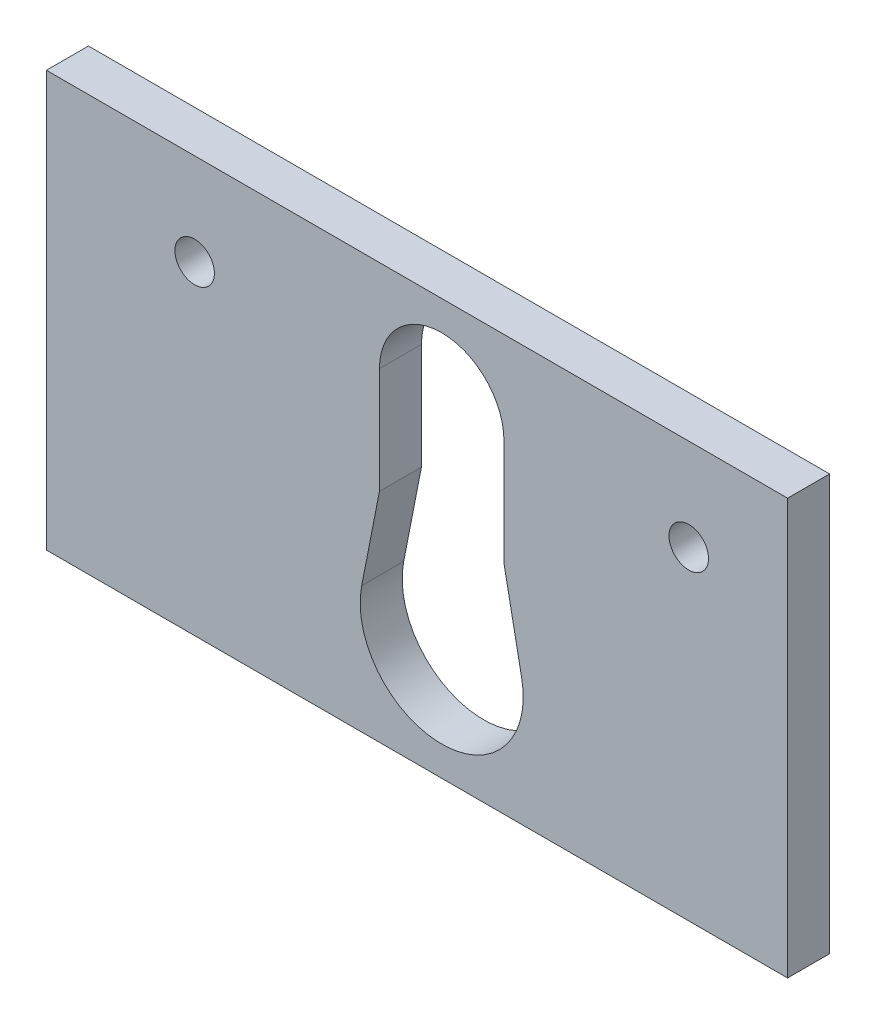
ISO-10303-21;
HEADER;
FILE_DESCRIPTION(('STEP AP214'),'2;1');
FILE_NAME('part.step','',(''),(''),'','','');
FILE_SCHEMA(('AUTOMOTIVE_DESIGN { 1 0 10303 214 1 1 1 1 }'));
ENDSEC;
DATA;
#1=APPLICATION_CONTEXT('core data for automotive mechanical design processes');
#2=APPLICATION_PROTOCOL_DEFINITION('international standard','automotive_design',2000,#1);
#3=PRODUCT_CONTEXT('',#1,'mechanical');
#4=PRODUCT('Part','Part','',(#3));
#5=PRODUCT_RELATED_PRODUCT_CATEGORY('part','',(#4));
#6=PRODUCT_DEFINITION_FORMATION('','',#4);
#7=PRODUCT_DEFINITION_CONTEXT('part definition',#1,'design');
#8=PRODUCT_DEFINITION('design','',#6,#7);
#9=PRODUCT_DEFINITION_SHAPE('','',#8);
#10=(LENGTH_UNIT() NAMED_UNIT(*) SI_UNIT(.MILLI.,.METRE.));
#11=(NAMED_UNIT(*) PLANE_ANGLE_UNIT() SI_UNIT($,.RADIAN.));
#12=(NAMED_UNIT(*) SI_UNIT($,.STERADIAN.) SOLID_ANGLE_UNIT());
#13=UNCERTAINTY_MEASURE_WITH_UNIT(LENGTH_MEASURE(1.E-05),#10,'distance_accuracy_value','');
#14=(GEOMETRIC_REPRESENTATION_CONTEXT(3) GLOBAL_UNCERTAINTY_ASSIGNED_CONTEXT((#13)) GLOBAL_UNIT_ASSIGNED_CONTEXT((#10,
#11,#12)) REPRESENTATION_CONTEXT('',''));
#15=CARTESIAN_POINT('',(0.,0.,0.));
#16=DIRECTION('',(0.,0.,1.));
#17=DIRECTION('',(1.,0.,0.));
#18=AXIS2_PLACEMENT_3D('',#15,#16,#17);
#19=CARTESIAN_POINT('',(-40.,0.,4.25));
#20=DIRECTION('',(-1.,0.,0.));
#21=DIRECTION('',(0.,0.,1.));
#22=AXIS2_PLACEMENT_3D('',#19,#20,#21);
#23=PLANE('',#22);
#24=DIRECTION('',(0.,1.,0.));
#25=VECTOR('',#24,1.);
#26=CARTESIAN_POINT('',(-40.,0.,0.));
#27=LINE('',#26,#25);
#28=CARTESIAN_POINT('',(-40.,-32.75,0.));
#29=VERTEX_POINT('',#28);
#30=CARTESIAN_POINT('',(-40.,9.29999999999999,0.));
#31=VERTEX_POINT('',#30);
#32=EDGE_CURVE('E171',#29,#31,#27,.T.);
#33=ORIENTED_EDGE('',*,*,#32,.F.);
#34=DIRECTION('',(0.,0.,-1.));
#35=VECTOR('',#34,1.);
#36=CARTESIAN_POINT('',(-40.,-32.75,4.25));
#37=LINE('',#36,#35);
#38=CARTESIAN_POINT('',(-40.,-32.75,4.25));
#39=VERTEX_POINT('',#38);
#40=EDGE_CURVE('E11',#39,#29,#37,.T.);
#41=ORIENTED_EDGE('',*,*,#40,.F.);
#42=DIRECTION('',(0.,1.,0.));
#43=VECTOR('',#42,1.);
#44=CARTESIAN_POINT('',(-40.,0.,4.25));
#45=LINE('',#44,#43);
#46=CARTESIAN_POINT('',(-40.,9.29999999999999,4.25));
#47=VERTEX_POINT('',#46);
#48=EDGE_CURVE('E139',#39,#47,#45,.T.);
#49=ORIENTED_EDGE('',*,*,#48,.T.);
#50=DIRECTION('',(0.,0.,-1.));
#51=VECTOR('',#50,1.);
#52=CARTESIAN_POINT('',(-40.,9.29999999999999,4.25));
#53=LINE('',#52,#51);
#54=EDGE_CURVE('E95',#47,#31,#53,.T.);
#55=ORIENTED_EDGE('',*,*,#54,.T.);
#56=EDGE_LOOP('',(#33,#41,#49,#55));
#57=FACE_BOUND('',#56,.T.);
#58=ADVANCED_FACE('F35',(#57),#23,.T.);
#59=CARTESIAN_POINT('',(0.,-32.75,4.25));
#60=DIRECTION('',(0.,-1.,0.));
#61=DIRECTION('',(0.,0.,-1.));
#62=AXIS2_PLACEMENT_3D('',#59,#60,#61);
#63=PLANE('',#62);
#64=DIRECTION('',(-1.,0.,0.));
#65=VECTOR('',#64,1.);
#66=CARTESIAN_POINT('',(0.,-32.75,0.));
#67=LINE('',#66,#65);
#68=CARTESIAN_POINT('',(35.,-32.75,0.));
#69=VERTEX_POINT('',#68);
#70=EDGE_CURVE('E129',#69,#29,#67,.T.);
#71=ORIENTED_EDGE('',*,*,#70,.F.);
#72=DIRECTION('',(0.,0.,-1.));
#73=VECTOR('',#72,1.);
#74=CARTESIAN_POINT('',(35.,-32.75,4.25));
#75=LINE('',#74,#73);
#76=CARTESIAN_POINT('',(35.,-32.75,4.25));
#77=VERTEX_POINT('',#76);
#78=EDGE_CURVE('E45',#77,#69,#75,.T.);
#79=ORIENTED_EDGE('',*,*,#78,.F.);
#80=DIRECTION('',(-1.,0.,0.));
#81=VECTOR('',#80,1.);
#82=CARTESIAN_POINT('',(0.,-32.75,4.25));
#83=LINE('',#82,#81);
#84=EDGE_CURVE('E127',#77,#39,#83,.T.);
#85=ORIENTED_EDGE('',*,*,#84,.T.);
#86=ORIENTED_EDGE('',*,*,#40,.T.);
#87=EDGE_LOOP('',(#71,#79,#85,#86));
#88=FACE_BOUND('',#87,.T.);
#89=ADVANCED_FACE('F125',(#88),#63,.T.);
#90=CARTESIAN_POINT('',(35.,0.,4.25));
#91=DIRECTION('',(-1.,0.,0.));
#92=DIRECTION('',(0.,0.,1.));
#93=AXIS2_PLACEMENT_3D('',#90,#91,#92);
#94=PLANE('',#93);
#95=DIRECTION('',(0.,1.,0.));
#96=VECTOR('',#95,1.);
#97=CARTESIAN_POINT('',(35.,0.,0.));
#98=LINE('',#97,#96);
#99=CARTESIAN_POINT('',(35.,9.3,0.));
#100=VERTEX_POINT('',#99);
#101=EDGE_CURVE('E174',#69,#100,#98,.T.);
#102=ORIENTED_EDGE('',*,*,#101,.T.);
#103=DIRECTION('',(0.,0.,-1.));
#104=VECTOR('',#103,1.);
#105=CARTESIAN_POINT('',(35.,9.3,4.25));
#106=LINE('',#105,#104);
#107=CARTESIAN_POINT('',(35.,9.3,4.25));
#108=VERTEX_POINT('',#107);
#109=EDGE_CURVE('E132',#108,#100,#106,.T.);
#110=ORIENTED_EDGE('',*,*,#109,.F.);
#111=DIRECTION('',(0.,1.,0.));
#112=VECTOR('',#111,1.);
#113=CARTESIAN_POINT('',(35.,0.,4.25));
#114=LINE('',#113,#112);
#115=EDGE_CURVE('E135',#77,#108,#114,.T.);
#116=ORIENTED_EDGE('',*,*,#115,.F.);
#117=ORIENTED_EDGE('',*,*,#78,.T.);
#118=EDGE_LOOP('',(#102,#110,#116,#117));
#119=FACE_BOUND('',#118,.T.);
#120=ADVANCED_FACE('F136',(#119),#94,.F.);
#121=CARTESIAN_POINT('',(0.,-21.5,4.25));
#122=DIRECTION('',(0.,0.,-1.));
#123=DIRECTION('',(-1.,0.,0.));
#124=AXIS2_PLACEMENT_3D('',#121,#122,#123);
#125=CYLINDRICAL_SURFACE('',#124,8.25);
#126=CARTESIAN_POINT('',(0.,-21.5,0.));
#127=DIRECTION('',(0.,0.,1.));
#128=DIRECTION('',(1.,0.,0.));
#129=AXIS2_PLACEMENT_3D('',#126,#127,#128);
#130=CIRCLE('',#129,8.25);
#131=CARTESIAN_POINT('',(-8.09596286982862,-19.9132154492949,0.));
#132=VERTEX_POINT('',#131);
#133=CARTESIAN_POINT('',(8.09596286982862,-19.9132154492949,0.));
#134=VERTEX_POINT('',#133);
#135=EDGE_CURVE('E153',#132,#134,#130,.T.);
#136=ORIENTED_EDGE('',*,*,#135,.F.);
#137=DIRECTION('',(0.,0.,-1.));
#138=VECTOR('',#137,1.);
#139=CARTESIAN_POINT('',(-8.09596286982862,-19.9132154492949,4.25));
#140=LINE('',#139,#138);
#141=CARTESIAN_POINT('',(-8.09596286982862,-19.9132154492949,4.25));
#142=VERTEX_POINT('',#141);
#143=EDGE_CURVE('E39',#142,#132,#140,.T.);
#144=ORIENTED_EDGE('',*,*,#143,.F.);
#145=CARTESIAN_POINT('',(0.,-21.5,4.25));
#146=DIRECTION('',(0.,0.,1.));
#147=DIRECTION('',(1.,0.,0.));
#148=AXIS2_PLACEMENT_3D('',#145,#146,#147);
#149=CIRCLE('',#148,8.25);
#150=CARTESIAN_POINT('',(8.09596286982862,-19.9132154492949,4.25));
#151=VERTEX_POINT('',#150);
#152=EDGE_CURVE('E219',#142,#151,#149,.T.);
#153=ORIENTED_EDGE('',*,*,#152,.T.);
#154=DIRECTION('',(0.,0.,-1.));
#155=VECTOR('',#154,1.);
#156=CARTESIAN_POINT('',(8.09596286982862,-19.9132154492949,4.25));
#157=LINE('',#156,#155);
#158=EDGE_CURVE('E146',#151,#134,#157,.T.);
#159=ORIENTED_EDGE('',*,*,#158,.T.);
#160=EDGE_LOOP('',(#136,#144,#153,#159));
#161=FACE_BOUND('',#160,.T.);
#162=ADVANCED_FACE('F197',(#161),#125,.F.);
#163=CARTESIAN_POINT('',(-4.03791623172525,0.791419525578749,4.25));
#164=DIRECTION('',(0.981328832706499,-0.192337521297586,0.));
#165=DIRECTION('',(0.192337521297586,0.981328832706499,0.));
#166=AXIS2_PLACEMENT_3D('',#163,#164,#165);
#167=PLANE('',#166);
#168=DIRECTION('',(-0.192337521297586,-0.981328832706499,0.));
#169=VECTOR('',#168,1.);
#170=CARTESIAN_POINT('',(-4.03791623172525,0.791419525578749,0.));
#171=LINE('',#170,#169);
#172=CARTESIAN_POINT('',(-6.3,-10.75,0.));
#173=VERTEX_POINT('',#172);
#174=EDGE_CURVE('E156',#173,#132,#171,.T.);
#175=ORIENTED_EDGE('',*,*,#174,.F.);
#176=DIRECTION('',(0.,0.,-1.));
#177=VECTOR('',#176,1.);
#178=CARTESIAN_POINT('',(-6.3,-10.75,4.25));
#179=LINE('',#178,#177);
#180=CARTESIAN_POINT('',(-6.3,-10.75,4.25));
#181=VERTEX_POINT('',#180);
#182=EDGE_CURVE('E187',#181,#173,#179,.T.);
#183=ORIENTED_EDGE('',*,*,#182,.F.);
#184=DIRECTION('',(-0.192337521297586,-0.981328832706499,0.));
#185=VECTOR('',#184,1.);
#186=CARTESIAN_POINT('',(-4.03791623172525,0.791419525578749,4.25));
#187=LINE('',#186,#185);
#188=EDGE_CURVE('E196',#181,#142,#187,.T.);
#189=ORIENTED_EDGE('',*,*,#188,.T.);
#190=ORIENTED_EDGE('',*,*,#143,.T.);
#191=EDGE_LOOP('',(#175,#183,#189,#190));
#192=FACE_BOUND('',#191,.T.);
#193=ADVANCED_FACE('F194',(#192),#167,.T.);
#194=CARTESIAN_POINT('',(-6.3,0.,4.25));
#195=DIRECTION('',(1.,0.,0.));
#196=DIRECTION('',(0.,0.,-1.));
#197=AXIS2_PLACEMENT_3D('',#194,#195,#196);
#198=PLANE('',#197);
#199=DIRECTION('',(0.,-1.,0.));
#200=VECTOR('',#199,1.);
#201=CARTESIAN_POINT('',(-6.3,0.,0.));
#202=LINE('',#201,#200);
#203=CARTESIAN_POINT('',(-6.3,0.,0.));
#204=VERTEX_POINT('',#203);
#205=EDGE_CURVE('E159',#204,#173,#202,.T.);
#206=ORIENTED_EDGE('',*,*,#205,.F.);
#207=DIRECTION('',(0.,0.,-1.));
#208=VECTOR('',#207,1.);
#209=CARTESIAN_POINT('',(-6.3,0.,4.25));
#210=LINE('',#209,#208);
#211=CARTESIAN_POINT('',(-6.3,0.,4.25));
#212=VERTEX_POINT('',#211);
#213=EDGE_CURVE('E186',#212,#204,#210,.T.);
#214=ORIENTED_EDGE('',*,*,#213,.F.);
#215=DIRECTION('',(0.,-1.,0.));
#216=VECTOR('',#215,1.);
#217=CARTESIAN_POINT('',(-6.3,0.,4.25));
#218=LINE('',#217,#216);
#219=EDGE_CURVE('E205',#212,#181,#218,.T.);
#220=ORIENTED_EDGE('',*,*,#219,.T.);
#221=ORIENTED_EDGE('',*,*,#182,.T.);
#222=EDGE_LOOP('',(#206,#214,#220,#221));
#223=FACE_BOUND('',#222,.T.);
#224=ADVANCED_FACE('F203',(#223),#198,.T.);
#225=CARTESIAN_POINT('',(0.,0.,4.25));
#226=DIRECTION('',(0.,0.,-1.));
#227=DIRECTION('',(-1.,0.,0.));
#228=AXIS2_PLACEMENT_3D('',#225,#226,#227);
#229=CYLINDRICAL_SURFACE('',#228,6.3);
#230=CARTESIAN_POINT('',(0.,0.,0.));
#231=DIRECTION('',(0.,0.,1.));
#232=DIRECTION('',(1.,0.,0.));
#233=AXIS2_PLACEMENT_3D('',#230,#231,#232);
#234=CIRCLE('',#233,6.3);
#235=CARTESIAN_POINT('',(6.3,0.,0.));
#236=VERTEX_POINT('',#235);
#237=EDGE_CURVE('E162',#236,#204,#234,.T.);
#238=ORIENTED_EDGE('',*,*,#237,.F.);
#239=DIRECTION('',(0.,0.,-1.));
#240=VECTOR('',#239,1.);
#241=CARTESIAN_POINT('',(6.3,0.,4.25));
#242=LINE('',#241,#240);
#243=CARTESIAN_POINT('',(6.3,0.,4.25));
#244=VERTEX_POINT('',#243);
#245=EDGE_CURVE('E184',#244,#236,#242,.T.);
#246=ORIENTED_EDGE('',*,*,#245,.F.);
#247=CARTESIAN_POINT('',(0.,0.,4.25));
#248=DIRECTION('',(0.,0.,1.));
#249=DIRECTION('',(1.,0.,0.));
#250=AXIS2_PLACEMENT_3D('',#247,#248,#249);
#251=CIRCLE('',#250,6.3);
#252=EDGE_CURVE('E211',#244,#212,#251,.T.);
#253=ORIENTED_EDGE('',*,*,#252,.T.);
#254=ORIENTED_EDGE('',*,*,#213,.T.);
#255=EDGE_LOOP('',(#238,#246,#253,#254));
#256=FACE_BOUND('',#255,.T.);
#257=ADVANCED_FACE('F213',(#256),#229,.F.);
#258=CARTESIAN_POINT('',(6.3,0.,4.25));
#259=DIRECTION('',(1.,0.,0.));
#260=DIRECTION('',(0.,1.,0.));
#261=AXIS2_PLACEMENT_3D('',#258,#259,#260);
#262=PLANE('',#261);
#263=DIRECTION('',(0.,-1.,0.));
#264=VECTOR('',#263,1.);
#265=CARTESIAN_POINT('',(6.3,0.,0.));
#266=LINE('',#265,#264);
#267=CARTESIAN_POINT('',(6.3,-10.75,0.));
#268=VERTEX_POINT('',#267);
#269=EDGE_CURVE('E165',#236,#268,#266,.T.);
#270=ORIENTED_EDGE('',*,*,#269,.T.);
#271=DIRECTION('',(0.,0.,-1.));
#272=VECTOR('',#271,1.);
#273=CARTESIAN_POINT('',(6.3,-10.75,4.25));
#274=LINE('',#273,#272);
#275=CARTESIAN_POINT('',(6.3,-10.75,4.25));
#276=VERTEX_POINT('',#275);
#277=EDGE_CURVE('E181',#276,#268,#274,.T.);
#278=ORIENTED_EDGE('',*,*,#277,.F.);
#279=DIRECTION('',(0.,-1.,0.));
#280=VECTOR('',#279,1.);
#281=CARTESIAN_POINT('',(6.3,0.,4.25));
#282=LINE('',#281,#280);
#283=EDGE_CURVE('E215',#244,#276,#282,.T.);
#284=ORIENTED_EDGE('',*,*,#283,.F.);
#285=ORIENTED_EDGE('',*,*,#245,.T.);
#286=EDGE_LOOP('',(#270,#278,#284,#285));
#287=FACE_BOUND('',#286,.T.);
#288=ADVANCED_FACE('F260',(#287),#262,.F.);
#289=CARTESIAN_POINT('',(4.03791623172525,0.791419525578749,4.25));
#290=DIRECTION('',(0.981328832706499,0.192337521297587,0.));
#291=DIRECTION('',(-0.192337521297587,0.981328832706499,0.));
#292=AXIS2_PLACEMENT_3D('',#289,#290,#291);
#293=PLANE('',#292);
#294=DIRECTION('',(0.192337521297587,-0.981328832706499,0.));
#295=VECTOR('',#294,1.);
#296=CARTESIAN_POINT('',(4.03791623172525,0.791419525578749,0.));
#297=LINE('',#296,#295);
#298=EDGE_CURVE('E168',#268,#134,#297,.T.);
#299=ORIENTED_EDGE('',*,*,#298,.T.);
#300=ORIENTED_EDGE('',*,*,#158,.F.);
#301=DIRECTION('',(0.192337521297587,-0.981328832706499,0.));
#302=VECTOR('',#301,1.);
#303=CARTESIAN_POINT('',(4.03791623172525,0.791419525578749,4.25));
#304=LINE('',#303,#302);
#305=EDGE_CURVE('E141',#276,#151,#304,.T.);
#306=ORIENTED_EDGE('',*,*,#305,.F.);
#307=ORIENTED_EDGE('',*,*,#277,.T.);
#308=EDGE_LOOP('',(#299,#300,#306,#307));
#309=FACE_BOUND('',#308,.T.);
#310=ADVANCED_FACE('F222',(#309),#293,.F.);
#311=CARTESIAN_POINT('',(25.,0.,4.25));
#312=DIRECTION('',(0.,0.,-1.));
#313=DIRECTION('',(-1.,0.,0.));
#314=AXIS2_PLACEMENT_3D('',#311,#312,#313);
#315=CYLINDRICAL_SURFACE('',#314,2.);
#316=CARTESIAN_POINT('',(25.,0.,4.25));
#317=DIRECTION('',(0.,0.,1.));
#318=DIRECTION('',(1.,0.,0.));
#319=AXIS2_PLACEMENT_3D('',#316,#317,#318);
#320=CIRCLE('',#319,2.);
#321=CARTESIAN_POINT('',(27.,0.,4.25));
#322=VERTEX_POINT('',#321);
#323=EDGE_CURVE('E223',#322,#322,#320,.T.);
#324=ORIENTED_EDGE('',*,*,#323,.T.);
#325=EDGE_LOOP('',(#324));
#326=FACE_BOUND('',#325,.T.);
#327=CARTESIAN_POINT('',(25.,0.,0.));
#328=DIRECTION('',(0.,0.,1.));
#329=DIRECTION('',(1.,0.,0.));
#330=AXIS2_PLACEMENT_3D('',#327,#328,#329);
#331=CIRCLE('',#330,2.);
#332=CARTESIAN_POINT('',(27.,0.,0.));
#333=VERTEX_POINT('',#332);
#334=EDGE_CURVE('E150',#333,#333,#331,.T.);
#335=ORIENTED_EDGE('',*,*,#334,.F.);
#336=EDGE_LOOP('',(#335));
#337=FACE_BOUND('',#336,.T.);
#338=ADVANCED_FACE('F239',(#326,#337),#315,.F.);
#339=CARTESIAN_POINT('',(-25.,0.,4.25));
#340=DIRECTION('',(0.,0.,-1.));
#341=DIRECTION('',(-1.,0.,0.));
#342=AXIS2_PLACEMENT_3D('',#339,#340,#341);
#343=CYLINDRICAL_SURFACE('',#342,2.);
#344=CARTESIAN_POINT('',(-25.,0.,4.25));
#345=DIRECTION('',(0.,0.,1.));
#346=DIRECTION('',(1.,0.,0.));
#347=AXIS2_PLACEMENT_3D('',#344,#345,#346);
#348=CIRCLE('',#347,2.);
#349=CARTESIAN_POINT('',(-23.,0.,4.25));
#350=VERTEX_POINT('',#349);
#351=EDGE_CURVE('E177',#350,#350,#348,.T.);
#352=ORIENTED_EDGE('',*,*,#351,.T.);
#353=EDGE_LOOP('',(#352));
#354=FACE_BOUND('',#353,.T.);
#355=CARTESIAN_POINT('',(-25.,0.,0.));
#356=DIRECTION('',(0.,0.,1.));
#357=DIRECTION('',(1.,0.,0.));
#358=AXIS2_PLACEMENT_3D('',#355,#356,#357);
#359=CIRCLE('',#358,2.);
#360=CARTESIAN_POINT('',(-23.,0.,0.));
#361=VERTEX_POINT('',#360);
#362=EDGE_CURVE('E147',#361,#361,#359,.T.);
#363=ORIENTED_EDGE('',*,*,#362,.F.);
#364=EDGE_LOOP('',(#363));
#365=FACE_BOUND('',#364,.T.);
#366=ADVANCED_FACE('F37',(#354,#365),#343,.F.);
#367=CARTESIAN_POINT('',(0.,9.3,4.25));
#368=DIRECTION('',(0.,-1.,0.));
#369=DIRECTION('',(1.,0.,0.));
#370=AXIS2_PLACEMENT_3D('',#367,#368,#369);
#371=PLANE('',#370);
#372=DIRECTION('',(-1.,0.,0.));
#373=VECTOR('',#372,1.);
#374=CARTESIAN_POINT('',(0.,9.3,0.));
#375=LINE('',#374,#373);
#376=EDGE_CURVE('E88',#100,#31,#375,.T.);
#377=ORIENTED_EDGE('',*,*,#376,.T.);
#378=ORIENTED_EDGE('',*,*,#54,.F.);
#379=DIRECTION('',(-1.,0.,0.));
#380=VECTOR('',#379,1.);
#381=CARTESIAN_POINT('',(0.,9.3,4.25));
#382=LINE('',#381,#380);
#383=EDGE_CURVE('E54',#108,#47,#382,.T.);
#384=ORIENTED_EDGE('',*,*,#383,.F.);
#385=ORIENTED_EDGE('',*,*,#109,.T.);
#386=EDGE_LOOP('',(#377,#378,#384,#385));
#387=FACE_BOUND('',#386,.T.);
#388=ADVANCED_FACE('F235',(#387),#371,.F.);
#389=CARTESIAN_POINT('',(0.,0.,4.25));
#390=DIRECTION('',(0.,0.,1.));
#391=DIRECTION('',(1.,0.,0.));
#392=AXIS2_PLACEMENT_3D('',#389,#390,#391);
#393=PLANE('',#392);
#394=ORIENTED_EDGE('',*,*,#351,.F.);
#395=EDGE_LOOP('',(#394));
#396=FACE_BOUND('',#395,.T.);
#397=ORIENTED_EDGE('',*,*,#323,.F.);
#398=EDGE_LOOP('',(#397));
#399=FACE_BOUND('',#398,.T.);
#400=ORIENTED_EDGE('',*,*,#152,.F.);
#401=ORIENTED_EDGE('',*,*,#188,.F.);
#402=ORIENTED_EDGE('',*,*,#219,.F.);
#403=ORIENTED_EDGE('',*,*,#252,.F.);
#404=ORIENTED_EDGE('',*,*,#283,.T.);
#405=ORIENTED_EDGE('',*,*,#305,.T.);
#406=EDGE_LOOP('',(#400,#401,#402,#403,#404,#405));
#407=FACE_BOUND('',#406,.T.);
#408=ORIENTED_EDGE('',*,*,#48,.F.);
#409=ORIENTED_EDGE('',*,*,#84,.F.);
#410=ORIENTED_EDGE('',*,*,#115,.T.);
#411=ORIENTED_EDGE('',*,*,#383,.T.);
#412=EDGE_LOOP('',(#408,#409,#410,#411));
#413=FACE_BOUND('',#412,.T.);
#414=ADVANCED_FACE('F138',(#396,#399,#407,#413),#393,.T.);
#415=CARTESIAN_POINT('',(0.,0.,0.));
#416=DIRECTION('',(0.,0.,1.));
#417=DIRECTION('',(1.,0.,0.));
#418=AXIS2_PLACEMENT_3D('',#415,#416,#417);
#419=PLANE('',#418);
#420=ORIENTED_EDGE('',*,*,#362,.T.);
#421=EDGE_LOOP('',(#420));
#422=FACE_BOUND('',#421,.T.);
#423=ORIENTED_EDGE('',*,*,#334,.T.);
#424=EDGE_LOOP('',(#423));
#425=FACE_BOUND('',#424,.T.);
#426=ORIENTED_EDGE('',*,*,#135,.T.);
#427=ORIENTED_EDGE('',*,*,#298,.F.);
#428=ORIENTED_EDGE('',*,*,#269,.F.);
#429=ORIENTED_EDGE('',*,*,#237,.T.);
#430=ORIENTED_EDGE('',*,*,#205,.T.);
#431=ORIENTED_EDGE('',*,*,#174,.T.);
#432=EDGE_LOOP('',(#426,#427,#428,#429,#430,#431));
#433=FACE_BOUND('',#432,.T.);
#434=ORIENTED_EDGE('',*,*,#32,.T.);
#435=ORIENTED_EDGE('',*,*,#376,.F.);
#436=ORIENTED_EDGE('',*,*,#101,.F.);
#437=ORIENTED_EDGE('',*,*,#70,.T.);
#438=EDGE_LOOP('',(#434,#435,#436,#437));
#439=FACE_BOUND('',#438,.T.);
#440=ADVANCED_FACE('F200',(#422,#425,#433,#439),#419,.F.);
#441=CLOSED_SHELL('',(#58,#89,#120,#162,#193,#224,#257,#288,#310,#338,#366,#388,#414,#440));
#442=MANIFOLD_SOLID_BREP('B2',#441);
#443=ADVANCED_BREP_SHAPE_REPRESENTATION('',(#18,#442),#14);
#444=SHAPE_DEFINITION_REPRESENTATION(#9,#443);
ENDSEC;
END-ISO-10303-21;
